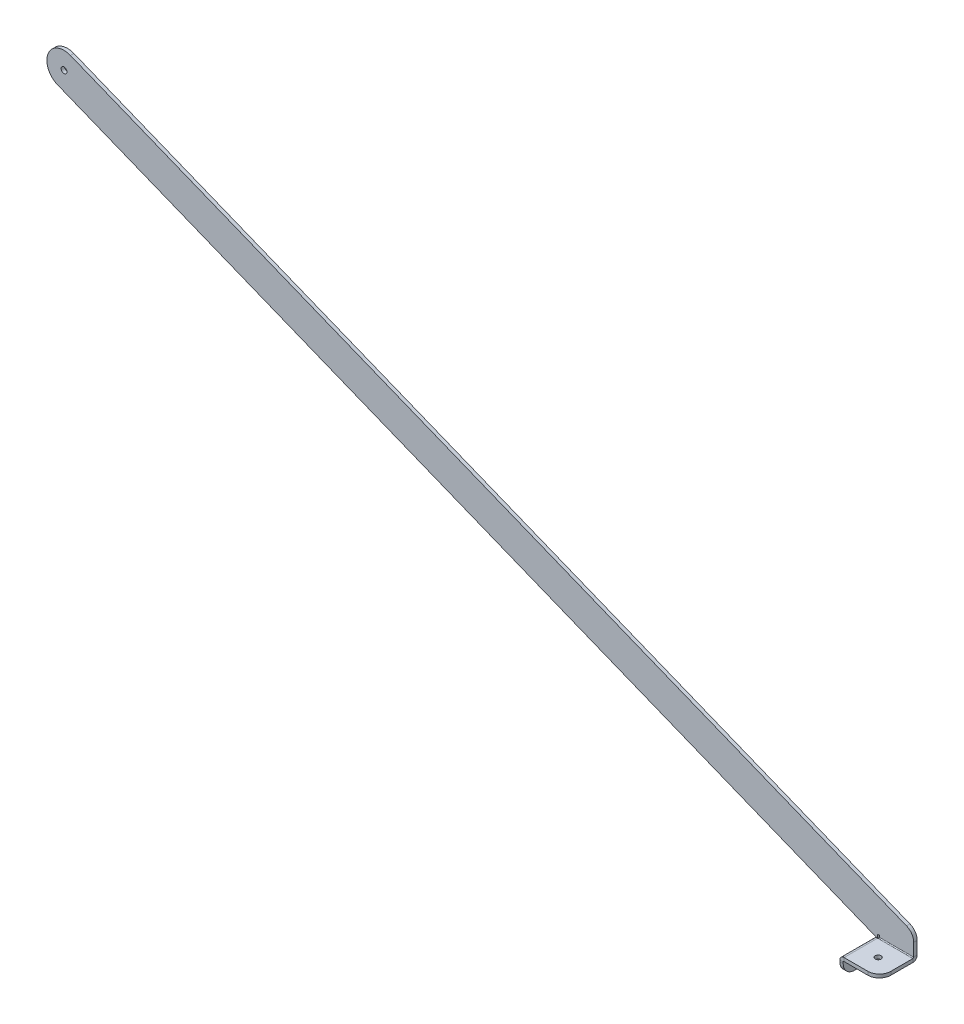
ISO-10303-21;
HEADER;
FILE_DESCRIPTION(('STEP AP214'),'2;1');
FILE_NAME('part.step','',(''),(''),'','','');
FILE_SCHEMA(('AUTOMOTIVE_DESIGN { 1 0 10303 214 1 1 1 1 }'));
ENDSEC;
DATA;
#1=APPLICATION_CONTEXT('core data for automotive mechanical design processes');
#2=APPLICATION_PROTOCOL_DEFINITION('international standard','automotive_design',2000,#1);
#3=PRODUCT_CONTEXT('',#1,'mechanical');
#4=PRODUCT('Part','Part','',(#3));
#5=PRODUCT_RELATED_PRODUCT_CATEGORY('part','',(#4));
#6=PRODUCT_DEFINITION_FORMATION('','',#4);
#7=PRODUCT_DEFINITION_CONTEXT('part definition',#1,'design');
#8=PRODUCT_DEFINITION('design','',#6,#7);
#9=PRODUCT_DEFINITION_SHAPE('','',#8);
#10=(LENGTH_UNIT() NAMED_UNIT(*) SI_UNIT(.MILLI.,.METRE.));
#11=(NAMED_UNIT(*) PLANE_ANGLE_UNIT() SI_UNIT($,.RADIAN.));
#12=(NAMED_UNIT(*) SI_UNIT($,.STERADIAN.) SOLID_ANGLE_UNIT());
#13=UNCERTAINTY_MEASURE_WITH_UNIT(LENGTH_MEASURE(1.E-05),#10,'distance_accuracy_value','');
#14=(GEOMETRIC_REPRESENTATION_CONTEXT(3) GLOBAL_UNCERTAINTY_ASSIGNED_CONTEXT((#13)) GLOBAL_UNIT_ASSIGNED_CONTEXT((#10,
#11,#12)) REPRESENTATION_CONTEXT('',''));
#15=CARTESIAN_POINT('',(0.,0.,0.));
#16=DIRECTION('',(0.,0.,1.));
#17=DIRECTION('',(1.,0.,0.));
#18=AXIS2_PLACEMENT_3D('',#15,#16,#17);
#19=CARTESIAN_POINT('',(388.5885,-144.00735,-3.));
#20=DIRECTION('',(1.,0.,0.));
#21=DIRECTION('',(0.,0.,-1.));
#22=AXIS2_PLACEMENT_3D('',#19,#20,#21);
#23=PLANE('',#22);
#24=DIRECTION('',(0.,1.,0.));
#25=VECTOR('',#24,1.);
#26=CARTESIAN_POINT('',(388.5885,-144.00735,0.));
#27=LINE('',#26,#25);
#28=CARTESIAN_POINT('',(388.5885,-141.67075,0.));
#29=VERTEX_POINT('',#28);
#30=CARTESIAN_POINT('',(388.5885,-130.486723104408,0.));
#31=VERTEX_POINT('',#30);
#32=EDGE_CURVE('E383',#29,#31,#27,.T.);
#33=ORIENTED_EDGE('',*,*,#32,.F.);
#34=DIRECTION('',(0.,0.,-1.));
#35=VECTOR('',#34,1.);
#36=CARTESIAN_POINT('',(388.5885,-141.67075,0.));
#37=LINE('',#36,#35);
#38=CARTESIAN_POINT('',(388.5885,-141.67075,-3.));
#39=VERTEX_POINT('',#38);
#40=EDGE_CURVE('E318',#29,#39,#37,.T.);
#41=ORIENTED_EDGE('',*,*,#40,.T.);
#42=DIRECTION('',(0.,1.,0.));
#43=VECTOR('',#42,1.);
#44=CARTESIAN_POINT('',(388.5885,-144.00735,-3.));
#45=LINE('',#44,#43);
#46=CARTESIAN_POINT('',(388.5885,-130.486723104408,-3.));
#47=VERTEX_POINT('',#46);
#48=EDGE_CURVE('E369',#39,#47,#45,.T.);
#49=ORIENTED_EDGE('',*,*,#48,.T.);
#50=DIRECTION('',(0.,0.,1.));
#51=VECTOR('',#50,1.);
#52=CARTESIAN_POINT('',(388.5885,-130.486723104408,-3.));
#53=LINE('',#52,#51);
#54=EDGE_CURVE('E395',#47,#31,#53,.T.);
#55=ORIENTED_EDGE('',*,*,#54,.T.);
#56=EDGE_LOOP('',(#33,#41,#49,#55));
#57=FACE_BOUND('',#56,.T.);
#58=ADVANCED_FACE('F75',(#57),#23,.T.);
#59=CARTESIAN_POINT('',(358.5885,-144.00735,-3.));
#60=DIRECTION('',(-0.372666281122487,-0.927965431960876,0.));
#61=DIRECTION('',(0.927965431960876,-0.372666281122487,0.));
#62=AXIS2_PLACEMENT_3D('',#59,#60,#61);
#63=PLANE('',#62);
#64=DIRECTION('',(0.927965431960876,-0.372666281122487,0.));
#65=VECTOR('',#64,1.);
#66=CARTESIAN_POINT('',(358.5885,-144.00735,-3.));
#67=LINE('',#66,#65);
#68=CARTESIAN_POINT('',(-358.5885,144.00735,-3.));
#69=VERTEX_POINT('',#68);
#70=CARTESIAN_POINT('',(357.0885,-143.404957494384,-3.));
#71=VERTEX_POINT('',#70);
#72=EDGE_CURVE('E365',#69,#71,#67,.T.);
#73=ORIENTED_EDGE('',*,*,#72,.T.);
#74=DIRECTION('',(0.,0.,-1.));
#75=VECTOR('',#74,1.);
#76=CARTESIAN_POINT('',(357.0885,-143.404957494384,0.));
#77=LINE('',#76,#75);
#78=CARTESIAN_POINT('',(357.0885,-143.404957494384,0.));
#79=VERTEX_POINT('',#78);
#80=EDGE_CURVE('E344',#79,#71,#77,.T.);
#81=ORIENTED_EDGE('',*,*,#80,.F.);
#82=DIRECTION('',(0.927965431960876,-0.372666281122487,0.));
#83=VECTOR('',#82,1.);
#84=CARTESIAN_POINT('',(358.5885,-144.00735,0.));
#85=LINE('',#84,#83);
#86=CARTESIAN_POINT('',(-358.5885,144.00735,0.));
#87=VERTEX_POINT('',#86);
#88=EDGE_CURVE('E380',#87,#79,#85,.T.);
#89=ORIENTED_EDGE('',*,*,#88,.F.);
#90=DIRECTION('',(0.,0.,1.));
#91=VECTOR('',#90,1.);
#92=CARTESIAN_POINT('',(-358.5885,144.00735,-3.));
#93=LINE('',#92,#91);
#94=EDGE_CURVE('E377',#69,#87,#93,.T.);
#95=ORIENTED_EDGE('',*,*,#94,.F.);
#96=EDGE_LOOP('',(#73,#81,#89,#95));
#97=FACE_BOUND('',#96,.T.);
#98=ADVANCED_FACE('F476',(#97),#63,.T.);
#99=CARTESIAN_POINT('',(-352.998505783163,157.926831479413,-3.));
#100=DIRECTION('',(0.,0.,1.));
#101=DIRECTION('',(1.,0.,0.));
#102=AXIS2_PLACEMENT_3D('',#99,#100,#101);
#103=PLANE('',#102);
#104=CARTESIAN_POINT('',(-352.998505783163,157.926831479413,-3.));
#105=DIRECTION('',(0.,0.,1.));
#106=DIRECTION('',(1.,0.,0.));
#107=AXIS2_PLACEMENT_3D('',#104,#105,#106);
#108=CIRCLE('',#107,2.54999999999999);
#109=CARTESIAN_POINT('',(-350.448505783163,157.926831479413,-3.));
#110=VERTEX_POINT('',#109);
#111=EDGE_CURVE('E356',#110,#110,#108,.T.);
#112=ORIENTED_EDGE('',*,*,#111,.T.);
#113=EDGE_LOOP('',(#112));
#114=FACE_BOUND('',#113,.T.);
#115=DIRECTION('',(1.,0.,0.));
#116=VECTOR('',#115,1.);
#117=CARTESIAN_POINT('',(388.5885,-141.67075,-3.));
#118=LINE('',#117,#116);
#119=CARTESIAN_POINT('',(358.5885,-141.67075,-3.));
#120=VERTEX_POINT('',#119);
#121=EDGE_CURVE('E311',#39,#120,#118,.F.);
#122=ORIENTED_EDGE('',*,*,#121,.T.);
#123=DIRECTION('',(0.,-1.,0.));
#124=VECTOR('',#123,1.);
#125=CARTESIAN_POINT('',(358.5885,157.926831479413,-3.));
#126=LINE('',#125,#124);
#127=CARTESIAN_POINT('',(358.5885,-140.17075,-3.));
#128=VERTEX_POINT('',#127);
#129=EDGE_CURVE('E353',#128,#120,#126,.T.);
#130=ORIENTED_EDGE('',*,*,#129,.F.);
#131=DIRECTION('',(1.,0.,0.));
#132=VECTOR('',#131,1.);
#133=CARTESIAN_POINT('',(-352.998505783163,-140.17075,-3.));
#134=LINE('',#133,#132);
#135=CARTESIAN_POINT('',(357.0885,-140.17075,-3.));
#136=VERTEX_POINT('',#135);
#137=EDGE_CURVE('E351',#136,#128,#134,.T.);
#138=ORIENTED_EDGE('',*,*,#137,.F.);
#139=DIRECTION('',(0.,1.,0.));
#140=VECTOR('',#139,1.);
#141=CARTESIAN_POINT('',(357.0885,157.926831479413,-3.));
#142=LINE('',#141,#140);
#143=EDGE_CURVE('E338',#71,#136,#142,.T.);
#144=ORIENTED_EDGE('',*,*,#143,.F.);
#145=ORIENTED_EDGE('',*,*,#72,.F.);
#146=CARTESIAN_POINT('',(-352.998505783163,157.926831479413,-3.));
#147=DIRECTION('',(0.,0.,1.));
#148=DIRECTION('',(1.,0.,0.));
#149=AXIS2_PLACEMENT_3D('',#146,#147,#148);
#150=CIRCLE('',#149,15.);
#151=CARTESIAN_POINT('',(-347.408511566325,171.846312958826,-3.));
#152=VERTEX_POINT('',#151);
#153=EDGE_CURVE('E362',#152,#69,#150,.T.);
#154=ORIENTED_EDGE('',*,*,#153,.F.);
#155=DIRECTION('',(-0.927965431960876,0.372666281122487,0.));
#156=VECTOR('',#155,1.);
#157=CARTESIAN_POINT('',(382.315162811225,-121.207068784799,-3.));
#158=LINE('',#157,#156);
#159=CARTESIAN_POINT('',(382.315162811225,-121.207068784799,-3.));
#160=VERTEX_POINT('',#159);
#161=EDGE_CURVE('E374',#160,#152,#158,.T.);
#162=ORIENTED_EDGE('',*,*,#161,.F.);
#163=CARTESIAN_POINT('',(378.5885,-130.486723104408,-3.));
#164=DIRECTION('',(0.,0.,1.));
#165=DIRECTION('',(-1.,0.,0.));
#166=AXIS2_PLACEMENT_3D('',#163,#164,#165);
#167=CIRCLE('',#166,10.);
#168=EDGE_CURVE('E371',#47,#160,#167,.T.);
#169=ORIENTED_EDGE('',*,*,#168,.F.);
#170=ORIENTED_EDGE('',*,*,#48,.F.);
#171=EDGE_LOOP('',(#122,#130,#138,#144,#145,#154,#162,#169,#170));
#172=FACE_BOUND('',#171,.T.);
#173=ADVANCED_FACE('F482',(#114,#172),#103,.F.);
#174=CARTESIAN_POINT('',(-352.998505783163,157.926831479413,0.));
#175=DIRECTION('',(0.,0.,1.));
#176=DIRECTION('',(1.,0.,0.));
#177=AXIS2_PLACEMENT_3D('',#174,#175,#176);
#178=PLANE('',#177);
#179=CARTESIAN_POINT('',(-352.998505783163,157.926831479413,0.));
#180=DIRECTION('',(0.,0.,1.));
#181=DIRECTION('',(1.,0.,0.));
#182=AXIS2_PLACEMENT_3D('',#179,#180,#181);
#183=CIRCLE('',#182,2.54999999999999);
#184=CARTESIAN_POINT('',(-350.448505783163,157.926831479413,0.));
#185=VERTEX_POINT('',#184);
#186=EDGE_CURVE('E355',#185,#185,#183,.T.);
#187=ORIENTED_EDGE('',*,*,#186,.F.);
#188=EDGE_LOOP('',(#187));
#189=FACE_BOUND('',#188,.T.);
#190=DIRECTION('',(0.,1.,0.));
#191=VECTOR('',#190,1.);
#192=CARTESIAN_POINT('',(358.5885,-141.67075,0.));
#193=LINE('',#192,#191);
#194=CARTESIAN_POINT('',(358.5885,-141.67075,0.));
#195=VERTEX_POINT('',#194);
#196=CARTESIAN_POINT('',(358.5885,-140.17075,0.));
#197=VERTEX_POINT('',#196);
#198=EDGE_CURVE('E335',#195,#197,#193,.T.);
#199=ORIENTED_EDGE('',*,*,#198,.F.);
#200=DIRECTION('',(1.,0.,0.));
#201=VECTOR('',#200,1.);
#202=CARTESIAN_POINT('',(388.5885,-141.67075,0.));
#203=LINE('',#202,#201);
#204=EDGE_CURVE('E324',#29,#195,#203,.F.);
#205=ORIENTED_EDGE('',*,*,#204,.F.);
#206=ORIENTED_EDGE('',*,*,#32,.T.);
#207=CARTESIAN_POINT('',(378.5885,-130.486723104408,0.));
#208=DIRECTION('',(0.,0.,1.));
#209=DIRECTION('',(-1.,0.,0.));
#210=AXIS2_PLACEMENT_3D('',#207,#208,#209);
#211=CIRCLE('',#210,10.);
#212=CARTESIAN_POINT('',(382.315162811225,-121.207068784799,0.));
#213=VERTEX_POINT('',#212);
#214=EDGE_CURVE('E385',#31,#213,#211,.T.);
#215=ORIENTED_EDGE('',*,*,#214,.T.);
#216=DIRECTION('',(-0.927965431960876,0.372666281122487,0.));
#217=VECTOR('',#216,1.);
#218=CARTESIAN_POINT('',(382.315162811225,-121.207068784799,0.));
#219=LINE('',#218,#217);
#220=CARTESIAN_POINT('',(-347.408511566325,171.846312958826,0.));
#221=VERTEX_POINT('',#220);
#222=EDGE_CURVE('E366',#213,#221,#219,.T.);
#223=ORIENTED_EDGE('',*,*,#222,.T.);
#224=CARTESIAN_POINT('',(-352.998505783163,157.926831479413,0.));
#225=DIRECTION('',(0.,0.,1.));
#226=DIRECTION('',(1.,0.,0.));
#227=AXIS2_PLACEMENT_3D('',#224,#225,#226);
#228=CIRCLE('',#227,15.);
#229=EDGE_CURVE('E359',#221,#87,#228,.T.);
#230=ORIENTED_EDGE('',*,*,#229,.T.);
#231=ORIENTED_EDGE('',*,*,#88,.T.);
#232=DIRECTION('',(0.,-1.,0.));
#233=VECTOR('',#232,1.);
#234=CARTESIAN_POINT('',(357.0885,-140.17075,0.));
#235=LINE('',#234,#233);
#236=CARTESIAN_POINT('',(357.0885,-140.17075,0.));
#237=VERTEX_POINT('',#236);
#238=EDGE_CURVE('E342',#237,#79,#235,.T.);
#239=ORIENTED_EDGE('',*,*,#238,.F.);
#240=DIRECTION('',(-1.,0.,0.));
#241=VECTOR('',#240,1.);
#242=CARTESIAN_POINT('',(358.5885,-140.17075,0.));
#243=LINE('',#242,#241);
#244=EDGE_CURVE('E339',#197,#237,#243,.T.);
#245=ORIENTED_EDGE('',*,*,#244,.F.);
#246=EDGE_LOOP('',(#199,#205,#206,#215,#223,#230,#231,#239,#245));
#247=FACE_BOUND('',#246,.T.);
#248=ADVANCED_FACE('F494',(#189,#247),#178,.T.);
#249=CARTESIAN_POINT('',(-352.998505783163,157.926831479413,-3.));
#250=DIRECTION('',(0.,0.,1.));
#251=DIRECTION('',(1.,0.,0.));
#252=AXIS2_PLACEMENT_3D('',#249,#250,#251);
#253=CYLINDRICAL_SURFACE('',#252,15.);
#254=ORIENTED_EDGE('',*,*,#229,.F.);
#255=DIRECTION('',(0.,0.,1.));
#256=VECTOR('',#255,1.);
#257=CARTESIAN_POINT('',(-347.408511566325,171.846312958826,-3.));
#258=LINE('',#257,#256);
#259=EDGE_CURVE('E390',#152,#221,#258,.T.);
#260=ORIENTED_EDGE('',*,*,#259,.F.);
#261=ORIENTED_EDGE('',*,*,#153,.T.);
#262=ORIENTED_EDGE('',*,*,#94,.T.);
#263=EDGE_LOOP('',(#254,#260,#261,#262));
#264=FACE_BOUND('',#263,.T.);
#265=ADVANCED_FACE('F490',(#264),#253,.T.);
#266=CARTESIAN_POINT('',(382.315162811225,-121.207068784799,-3.));
#267=DIRECTION('',(0.372666281122487,0.927965431960876,0.));
#268=DIRECTION('',(-0.927965431960876,0.372666281122487,0.));
#269=AXIS2_PLACEMENT_3D('',#266,#267,#268);
#270=PLANE('',#269);
#271=ORIENTED_EDGE('',*,*,#222,.F.);
#272=DIRECTION('',(0.,0.,1.));
#273=VECTOR('',#272,1.);
#274=CARTESIAN_POINT('',(382.315162811225,-121.207068784799,-3.));
#275=LINE('',#274,#273);
#276=EDGE_CURVE('E393',#160,#213,#275,.T.);
#277=ORIENTED_EDGE('',*,*,#276,.F.);
#278=ORIENTED_EDGE('',*,*,#161,.T.);
#279=ORIENTED_EDGE('',*,*,#259,.T.);
#280=EDGE_LOOP('',(#271,#277,#278,#279));
#281=FACE_BOUND('',#280,.T.);
#282=ADVANCED_FACE('F493',(#281),#270,.T.);
#283=CARTESIAN_POINT('',(378.5885,-130.486723104408,-3.));
#284=DIRECTION('',(0.,0.,1.));
#285=DIRECTION('',(1.,0.,0.));
#286=AXIS2_PLACEMENT_3D('',#283,#284,#285);
#287=CYLINDRICAL_SURFACE('',#286,10.);
#288=ORIENTED_EDGE('',*,*,#214,.F.);
#289=ORIENTED_EDGE('',*,*,#54,.F.);
#290=ORIENTED_EDGE('',*,*,#168,.T.);
#291=ORIENTED_EDGE('',*,*,#276,.T.);
#292=EDGE_LOOP('',(#288,#289,#290,#291));
#293=FACE_BOUND('',#292,.T.);
#294=ADVANCED_FACE('F487',(#293),#287,.T.);
#295=CARTESIAN_POINT('',(-352.998505783163,157.926831479413,-3.));
#296=DIRECTION('',(0.,0.,1.));
#297=DIRECTION('',(1.,0.,0.));
#298=AXIS2_PLACEMENT_3D('',#295,#296,#297);
#299=CYLINDRICAL_SURFACE('',#298,2.54999999999999);
#300=ORIENTED_EDGE('',*,*,#111,.F.);
#301=EDGE_LOOP('',(#300));
#302=FACE_BOUND('',#301,.T.);
#303=ORIENTED_EDGE('',*,*,#186,.T.);
#304=EDGE_LOOP('',(#303));
#305=FACE_BOUND('',#304,.T.);
#306=ADVANCED_FACE('F550',(#302,#305),#299,.F.);
#307=CARTESIAN_POINT('',(358.5885,-141.67075,0.));
#308=DIRECTION('',(-1.,0.,0.));
#309=DIRECTION('',(0.,0.,1.));
#310=AXIS2_PLACEMENT_3D('',#307,#308,#309);
#311=PLANE('',#310);
#312=DIRECTION('',(0.,0.,-1.));
#313=VECTOR('',#312,1.);
#314=CARTESIAN_POINT('',(358.5885,-140.17075,0.));
#315=LINE('',#314,#313);
#316=EDGE_CURVE('E341',#197,#128,#315,.T.);
#317=ORIENTED_EDGE('',*,*,#316,.T.);
#318=ORIENTED_EDGE('',*,*,#129,.T.);
#319=DIRECTION('',(0.,0.,-1.));
#320=VECTOR('',#319,1.);
#321=CARTESIAN_POINT('',(358.5885,-141.67075,0.));
#322=LINE('',#321,#320);
#323=EDGE_CURVE('E329',#195,#120,#322,.T.);
#324=ORIENTED_EDGE('',*,*,#323,.F.);
#325=ORIENTED_EDGE('',*,*,#198,.T.);
#326=EDGE_LOOP('',(#317,#318,#324,#325));
#327=FACE_BOUND('',#326,.T.);
#328=ADVANCED_FACE('F524',(#327),#311,.T.);
#329=CARTESIAN_POINT('',(358.5885,-140.17075,0.));
#330=DIRECTION('',(0.,-1.,0.));
#331=DIRECTION('',(0.,0.,-1.));
#332=AXIS2_PLACEMENT_3D('',#329,#330,#331);
#333=PLANE('',#332);
#334=DIRECTION('',(0.,0.,-1.));
#335=VECTOR('',#334,1.);
#336=CARTESIAN_POINT('',(357.0885,-140.17075,0.));
#337=LINE('',#336,#335);
#338=EDGE_CURVE('E332',#237,#136,#337,.T.);
#339=ORIENTED_EDGE('',*,*,#338,.T.);
#340=ORIENTED_EDGE('',*,*,#137,.T.);
#341=ORIENTED_EDGE('',*,*,#316,.F.);
#342=ORIENTED_EDGE('',*,*,#244,.T.);
#343=EDGE_LOOP('',(#339,#340,#341,#342));
#344=FACE_BOUND('',#343,.T.);
#345=ADVANCED_FACE('F531',(#344),#333,.T.);
#346=CARTESIAN_POINT('',(357.0885,-140.17075,0.));
#347=DIRECTION('',(1.,0.,0.));
#348=DIRECTION('',(0.,0.,-1.));
#349=AXIS2_PLACEMENT_3D('',#346,#347,#348);
#350=PLANE('',#349);
#351=ORIENTED_EDGE('',*,*,#80,.T.);
#352=ORIENTED_EDGE('',*,*,#143,.T.);
#353=ORIENTED_EDGE('',*,*,#338,.F.);
#354=ORIENTED_EDGE('',*,*,#238,.T.);
#355=EDGE_LOOP('',(#351,#352,#353,#354));
#356=FACE_BOUND('',#355,.T.);
#357=ADVANCED_FACE('F534',(#356),#350,.T.);
#358=CARTESIAN_POINT('',(358.5885,-141.67075,0.736600000000007));
#359=DIRECTION('',(-1.,0.,0.));
#360=DIRECTION('',(0.,0.,1.));
#361=AXIS2_PLACEMENT_3D('',#358,#359,#360);
#362=PLANE('',#361);
#363=DIRECTION('',(0.,-1.,0.));
#364=VECTOR('',#363,1.);
#365=CARTESIAN_POINT('',(358.5885,-145.40735,0.736599999999993));
#366=LINE('',#365,#364);
#367=CARTESIAN_POINT('',(358.5885,-142.40735,0.736600000000004));
#368=VERTEX_POINT('',#367);
#369=CARTESIAN_POINT('',(358.5885,-145.40735,0.736599999999993));
#370=VERTEX_POINT('',#369);
#371=EDGE_CURVE('E289',#368,#370,#366,.T.);
#372=ORIENTED_EDGE('',*,*,#371,.F.);
#373=CARTESIAN_POINT('',(358.5885,-141.67075,0.736600000000007));
#374=DIRECTION('',(1.,0.,0.));
#375=DIRECTION('',(0.,0.,-1.));
#376=AXIS2_PLACEMENT_3D('',#373,#374,#375);
#377=CIRCLE('',#376,0.736600000000004);
#378=EDGE_CURVE('E321',#195,#368,#377,.F.);
#379=ORIENTED_EDGE('',*,*,#378,.F.);
#380=ORIENTED_EDGE('',*,*,#323,.T.);
#381=CARTESIAN_POINT('',(358.5885,-141.67075,0.736600000000007));
#382=DIRECTION('',(1.,0.,0.));
#383=DIRECTION('',(0.,0.,-1.));
#384=AXIS2_PLACEMENT_3D('',#381,#382,#383);
#385=CIRCLE('',#384,3.7366);
#386=EDGE_CURVE('E314',#120,#370,#385,.F.);
#387=ORIENTED_EDGE('',*,*,#386,.T.);
#388=EDGE_LOOP('',(#372,#379,#380,#387));
#389=FACE_BOUND('',#388,.T.);
#390=ADVANCED_FACE('F521',(#389),#362,.T.);
#391=CARTESIAN_POINT('',(388.5885,-141.67075,0.736600000000007));
#392=DIRECTION('',(-1.,0.,0.));
#393=DIRECTION('',(0.,0.,1.));
#394=AXIS2_PLACEMENT_3D('',#391,#392,#393);
#395=PLANE('',#394);
#396=CARTESIAN_POINT('',(388.5885,-141.67075,0.736600000000007));
#397=DIRECTION('',(1.,0.,0.));
#398=DIRECTION('',(0.,0.,-1.));
#399=AXIS2_PLACEMENT_3D('',#396,#397,#398);
#400=CIRCLE('',#399,0.736600000000004);
#401=CARTESIAN_POINT('',(388.5885,-142.40735,0.736600000000004));
#402=VERTEX_POINT('',#401);
#403=EDGE_CURVE('E292',#402,#29,#400,.T.);
#404=ORIENTED_EDGE('',*,*,#403,.F.);
#405=DIRECTION('',(0.,-1.,0.));
#406=VECTOR('',#405,1.);
#407=CARTESIAN_POINT('',(388.5885,-142.40735,0.736600000000004));
#408=LINE('',#407,#406);
#409=CARTESIAN_POINT('',(388.5885,-145.40735,0.736599999999993));
#410=VERTEX_POINT('',#409);
#411=EDGE_CURVE('E303',#402,#410,#408,.T.);
#412=ORIENTED_EDGE('',*,*,#411,.T.);
#413=CARTESIAN_POINT('',(388.5885,-141.67075,0.736600000000007));
#414=DIRECTION('',(1.,0.,0.));
#415=DIRECTION('',(0.,0.,-1.));
#416=AXIS2_PLACEMENT_3D('',#413,#414,#415);
#417=CIRCLE('',#416,3.7366);
#418=EDGE_CURVE('E315',#410,#39,#417,.T.);
#419=ORIENTED_EDGE('',*,*,#418,.T.);
#420=ORIENTED_EDGE('',*,*,#40,.F.);
#421=EDGE_LOOP('',(#404,#412,#419,#420));
#422=FACE_BOUND('',#421,.T.);
#423=ADVANCED_FACE('F516',(#422),#395,.F.);
#424=CARTESIAN_POINT('',(388.5885,-141.67075,0.736600000000007));
#425=DIRECTION('',(1.,0.,0.));
#426=DIRECTION('',(0.,-1.,0.));
#427=AXIS2_PLACEMENT_3D('',#424,#425,#426);
#428=CYLINDRICAL_SURFACE('',#427,3.7366);
#429=ORIENTED_EDGE('',*,*,#121,.F.);
#430=ORIENTED_EDGE('',*,*,#418,.F.);
#431=DIRECTION('',(1.,0.,0.));
#432=VECTOR('',#431,1.);
#433=CARTESIAN_POINT('',(0.,-145.40735,0.736599999999993));
#434=LINE('',#433,#432);
#435=EDGE_CURVE('E300',#370,#410,#434,.T.);
#436=ORIENTED_EDGE('',*,*,#435,.F.);
#437=ORIENTED_EDGE('',*,*,#386,.F.);
#438=EDGE_LOOP('',(#429,#430,#436,#437));
#439=FACE_BOUND('',#438,.T.);
#440=ADVANCED_FACE('F511',(#439),#428,.T.);
#441=CARTESIAN_POINT('',(388.5885,-141.67075,0.736600000000007));
#442=DIRECTION('',(1.,0.,0.));
#443=DIRECTION('',(0.,-1.,0.));
#444=AXIS2_PLACEMENT_3D('',#441,#442,#443);
#445=CYLINDRICAL_SURFACE('',#444,0.736600000000004);
#446=ORIENTED_EDGE('',*,*,#204,.T.);
#447=ORIENTED_EDGE('',*,*,#378,.T.);
#448=DIRECTION('',(-1.,0.,0.));
#449=VECTOR('',#448,1.);
#450=CARTESIAN_POINT('',(358.5885,-142.40735,0.736600000000004));
#451=LINE('',#450,#449);
#452=EDGE_CURVE('E306',#368,#402,#451,.F.);
#453=ORIENTED_EDGE('',*,*,#452,.T.);
#454=ORIENTED_EDGE('',*,*,#403,.T.);
#455=EDGE_LOOP('',(#446,#447,#453,#454));
#456=FACE_BOUND('',#455,.T.);
#457=ADVANCED_FACE('F518',(#456),#445,.F.);
#458=CARTESIAN_POINT('',(388.5885,-145.40735,0.));
#459=DIRECTION('',(1.,0.,0.));
#460=DIRECTION('',(0.,0.,-1.));
#461=AXIS2_PLACEMENT_3D('',#458,#459,#460);
#462=PLANE('',#461);
#463=DIRECTION('',(0.,0.,1.));
#464=VECTOR('',#463,1.);
#465=CARTESIAN_POINT('',(388.5885,-142.40735,-5.32934252284178E-13));
#466=LINE('',#465,#464);
#467=CARTESIAN_POINT('',(388.5885,-142.40735,20.));
#468=VERTEX_POINT('',#467);
#469=EDGE_CURVE('E296',#468,#402,#466,.F.);
#470=ORIENTED_EDGE('',*,*,#469,.F.);
#471=DIRECTION('',(0.,1.,0.));
#472=VECTOR('',#471,1.);
#473=CARTESIAN_POINT('',(388.5885,-145.40735,20.));
#474=LINE('',#473,#472);
#475=CARTESIAN_POINT('',(388.5885,-145.40735,20.));
#476=VERTEX_POINT('',#475);
#477=EDGE_CURVE('E83',#468,#476,#474,.F.);
#478=ORIENTED_EDGE('',*,*,#477,.T.);
#479=DIRECTION('',(0.,0.,-1.));
#480=VECTOR('',#479,1.);
#481=CARTESIAN_POINT('',(388.5885,-145.40735,0.));
#482=LINE('',#481,#480);
#483=EDGE_CURVE('E290',#476,#410,#482,.T.);
#484=ORIENTED_EDGE('',*,*,#483,.T.);
#485=ORIENTED_EDGE('',*,*,#411,.F.);
#486=EDGE_LOOP('',(#470,#478,#484,#485));
#487=FACE_BOUND('',#486,.T.);
#488=ADVANCED_FACE('F471',(#487),#462,.T.);
#489=CARTESIAN_POINT('',(0.,-145.40735,-5.43408696300708E-13));
#490=DIRECTION('',(0.,-1.,0.));
#491=DIRECTION('',(0.,0.,-1.));
#492=AXIS2_PLACEMENT_3D('',#489,#490,#491);
#493=PLANE('',#492);
#494=CARTESIAN_POINT('',(372.5585,-145.40735,15.));
#495=DIRECTION('',(0.,-1.,0.));
#496=DIRECTION('',(0.,0.,-1.));
#497=AXIS2_PLACEMENT_3D('',#494,#495,#496);
#498=CIRCLE('',#497,2.55);
#499=CARTESIAN_POINT('',(372.5585,-145.40735,12.45));
#500=VERTEX_POINT('',#499);
#501=EDGE_CURVE('E268',#500,#500,#498,.T.);
#502=ORIENTED_EDGE('',*,*,#501,.F.);
#503=EDGE_LOOP('',(#502));
#504=FACE_BOUND('',#503,.T.);
#505=ORIENTED_EDGE('',*,*,#483,.F.);
#506=CARTESIAN_POINT('',(378.5885,-145.40735,20.));
#507=DIRECTION('',(0.,-1.,0.));
#508=DIRECTION('',(0.,0.,-1.));
#509=AXIS2_PLACEMENT_3D('',#506,#507,#508);
#510=CIRCLE('',#509,10.);
#511=CARTESIAN_POINT('',(378.5885,-145.40735,30.));
#512=VERTEX_POINT('',#511);
#513=EDGE_CURVE('E13',#476,#512,#510,.T.);
#514=ORIENTED_EDGE('',*,*,#513,.T.);
#515=DIRECTION('',(1.,0.,0.));
#516=VECTOR('',#515,1.);
#517=CARTESIAN_POINT('',(388.5885,-145.40735,30.));
#518=LINE('',#517,#516);
#519=CARTESIAN_POINT('',(357.7885,-145.40735,30.));
#520=VERTEX_POINT('',#519);
#521=EDGE_CURVE('E293',#520,#512,#518,.T.);
#522=ORIENTED_EDGE('',*,*,#521,.F.);
#523=DIRECTION('',(0.,0.,-1.));
#524=VECTOR('',#523,1.);
#525=CARTESIAN_POINT('',(357.7885,-145.40735,0.73659999999999));
#526=LINE('',#525,#524);
#527=CARTESIAN_POINT('',(357.7885,-145.40735,0.73659999999999));
#528=VERTEX_POINT('',#527);
#529=EDGE_CURVE('E275',#528,#520,#526,.F.);
#530=ORIENTED_EDGE('',*,*,#529,.F.);
#531=DIRECTION('',(1.,0.,0.));
#532=VECTOR('',#531,1.);
#533=CARTESIAN_POINT('',(357.7885,-145.40735,0.73659999999999));
#534=LINE('',#533,#532);
#535=EDGE_CURVE('E286',#528,#370,#534,.T.);
#536=ORIENTED_EDGE('',*,*,#535,.T.);
#537=ORIENTED_EDGE('',*,*,#435,.T.);
#538=EDGE_LOOP('',(#505,#514,#522,#530,#536,#537));
#539=FACE_BOUND('',#538,.T.);
#540=ADVANCED_FACE('F464',(#504,#539),#493,.T.);
#541=CARTESIAN_POINT('',(0.,-142.40735,-5.32934252284178E-13));
#542=DIRECTION('',(0.,-1.,0.));
#543=DIRECTION('',(0.,0.,-1.));
#544=AXIS2_PLACEMENT_3D('',#541,#542,#543);
#545=PLANE('',#544);
#546=CARTESIAN_POINT('',(372.5585,-142.40735,15.));
#547=DIRECTION('',(0.,1.,0.));
#548=DIRECTION('',(0.,0.,1.));
#549=AXIS2_PLACEMENT_3D('',#546,#547,#548);
#550=CIRCLE('',#549,2.55);
#551=CARTESIAN_POINT('',(372.5585,-142.40735,17.55));
#552=VERTEX_POINT('',#551);
#553=EDGE_CURVE('E457',#552,#552,#550,.T.);
#554=ORIENTED_EDGE('',*,*,#553,.F.);
#555=EDGE_LOOP('',(#554));
#556=FACE_BOUND('',#555,.T.);
#557=DIRECTION('',(-1.,0.,0.));
#558=VECTOR('',#557,1.);
#559=CARTESIAN_POINT('',(0.,-142.40735,30.));
#560=LINE('',#559,#558);
#561=CARTESIAN_POINT('',(357.7885,-142.40735,30.));
#562=VERTEX_POINT('',#561);
#563=CARTESIAN_POINT('',(378.5885,-142.40735,30.));
#564=VERTEX_POINT('',#563);
#565=EDGE_CURVE('E298',#562,#564,#560,.F.);
#566=ORIENTED_EDGE('',*,*,#565,.T.);
#567=CARTESIAN_POINT('',(378.5885,-142.40735,20.));
#568=DIRECTION('',(0.,-1.,0.));
#569=DIRECTION('',(0.,0.,-1.));
#570=AXIS2_PLACEMENT_3D('',#567,#568,#569);
#571=CIRCLE('',#570,10.);
#572=EDGE_CURVE('E97',#564,#468,#571,.F.);
#573=ORIENTED_EDGE('',*,*,#572,.T.);
#574=ORIENTED_EDGE('',*,*,#469,.T.);
#575=ORIENTED_EDGE('',*,*,#452,.F.);
#576=DIRECTION('',(1.,0.,0.));
#577=VECTOR('',#576,1.);
#578=CARTESIAN_POINT('',(357.7885,-142.40735,0.73659999999999));
#579=LINE('',#578,#577);
#580=CARTESIAN_POINT('',(357.7885,-142.40735,0.73659999999999));
#581=VERTEX_POINT('',#580);
#582=EDGE_CURVE('E281',#581,#368,#579,.T.);
#583=ORIENTED_EDGE('',*,*,#582,.F.);
#584=DIRECTION('',(0.,0.,-1.));
#585=VECTOR('',#584,1.);
#586=CARTESIAN_POINT('',(357.7885,-142.40735,0.73659999999999));
#587=LINE('',#586,#585);
#588=EDGE_CURVE('E223',#581,#562,#587,.F.);
#589=ORIENTED_EDGE('',*,*,#588,.T.);
#590=EDGE_LOOP('',(#566,#573,#574,#575,#583,#589));
#591=FACE_BOUND('',#590,.T.);
#592=ADVANCED_FACE('F426',(#556,#591),#545,.F.);
#593=CARTESIAN_POINT('',(388.5885,-145.40735,30.));
#594=DIRECTION('',(0.,0.,1.));
#595=DIRECTION('',(0.,-1.,0.));
#596=AXIS2_PLACEMENT_3D('',#593,#594,#595);
#597=PLANE('',#596);
#598=ORIENTED_EDGE('',*,*,#521,.T.);
#599=DIRECTION('',(0.,1.,0.));
#600=VECTOR('',#599,1.);
#601=CARTESIAN_POINT('',(378.5885,-145.40735,30.));
#602=LINE('',#601,#600);
#603=EDGE_CURVE('E415',#512,#564,#602,.T.);
#604=ORIENTED_EDGE('',*,*,#603,.T.);
#605=ORIENTED_EDGE('',*,*,#565,.F.);
#606=DIRECTION('',(0.,1.,0.));
#607=VECTOR('',#606,1.);
#608=CARTESIAN_POINT('',(357.7885,-145.40735,30.));
#609=LINE('',#608,#607);
#610=EDGE_CURVE('E278',#520,#562,#609,.T.);
#611=ORIENTED_EDGE('',*,*,#610,.F.);
#612=EDGE_LOOP('',(#598,#604,#605,#611));
#613=FACE_BOUND('',#612,.T.);
#614=ADVANCED_FACE('F421',(#613),#597,.T.);
#615=CARTESIAN_POINT('',(357.7885,-145.40735,0.73659999999999));
#616=DIRECTION('',(0.,0.,-1.));
#617=DIRECTION('',(0.,1.,0.));
#618=AXIS2_PLACEMENT_3D('',#615,#616,#617);
#619=PLANE('',#618);
#620=ORIENTED_EDGE('',*,*,#535,.F.);
#621=DIRECTION('',(0.,1.,0.));
#622=VECTOR('',#621,1.);
#623=CARTESIAN_POINT('',(357.7885,-145.40735,0.73659999999999));
#624=LINE('',#623,#622);
#625=EDGE_CURVE('E271',#528,#581,#624,.T.);
#626=ORIENTED_EDGE('',*,*,#625,.T.);
#627=ORIENTED_EDGE('',*,*,#582,.T.);
#628=ORIENTED_EDGE('',*,*,#371,.T.);
#629=EDGE_LOOP('',(#620,#626,#627,#628));
#630=FACE_BOUND('',#629,.T.);
#631=ADVANCED_FACE('F430',(#630),#619,.T.);
#632=CARTESIAN_POINT('',(357.7885,-146.14395,30.));
#633=DIRECTION('',(0.,0.,1.));
#634=DIRECTION('',(1.,0.,0.));
#635=AXIS2_PLACEMENT_3D('',#632,#633,#634);
#636=PLANE('',#635);
#637=DIRECTION('',(1.,0.,0.));
#638=VECTOR('',#637,1.);
#639=CARTESIAN_POINT('',(354.0519,-146.14395,30.));
#640=LINE('',#639,#638);
#641=CARTESIAN_POINT('',(357.0519,-146.14395,30.));
#642=VERTEX_POINT('',#641);
#643=CARTESIAN_POINT('',(354.0519,-146.14395,30.));
#644=VERTEX_POINT('',#643);
#645=EDGE_CURVE('E265',#642,#644,#640,.F.);
#646=ORIENTED_EDGE('',*,*,#645,.F.);
#647=CARTESIAN_POINT('',(357.7885,-146.14395,30.));
#648=DIRECTION('',(0.,0.,-1.));
#649=DIRECTION('',(-1.,0.,0.));
#650=AXIS2_PLACEMENT_3D('',#647,#648,#649);
#651=CIRCLE('',#650,0.736599999999976);
#652=EDGE_CURVE('E226',#520,#642,#651,.F.);
#653=ORIENTED_EDGE('',*,*,#652,.F.);
#654=ORIENTED_EDGE('',*,*,#610,.T.);
#655=CARTESIAN_POINT('',(357.7885,-146.14395,30.));
#656=DIRECTION('',(0.,0.,-1.));
#657=DIRECTION('',(-1.,0.,0.));
#658=AXIS2_PLACEMENT_3D('',#655,#656,#657);
#659=CIRCLE('',#658,3.73659999999998);
#660=EDGE_CURVE('E270',#562,#644,#659,.F.);
#661=ORIENTED_EDGE('',*,*,#660,.T.);
#662=EDGE_LOOP('',(#646,#653,#654,#661));
#663=FACE_BOUND('',#662,.T.);
#664=ADVANCED_FACE('F689',(#663),#636,.T.);
#665=CARTESIAN_POINT('',(357.7885,-146.14395,0.73659999999999));
#666=DIRECTION('',(0.,0.,1.));
#667=DIRECTION('',(1.,0.,0.));
#668=AXIS2_PLACEMENT_3D('',#665,#666,#667);
#669=PLANE('',#668);
#670=CARTESIAN_POINT('',(357.7885,-146.14395,0.73659999999999));
#671=DIRECTION('',(0.,0.,-1.));
#672=DIRECTION('',(-1.,0.,0.));
#673=AXIS2_PLACEMENT_3D('',#670,#671,#672);
#674=CIRCLE('',#673,0.736599999999976);
#675=CARTESIAN_POINT('',(357.0519,-146.14395,0.73659999999999));
#676=VERTEX_POINT('',#675);
#677=EDGE_CURVE('E233',#676,#528,#674,.T.);
#678=ORIENTED_EDGE('',*,*,#677,.F.);
#679=DIRECTION('',(1.,0.,0.));
#680=VECTOR('',#679,1.);
#681=CARTESIAN_POINT('',(357.0519,-146.14395,0.73659999999999));
#682=LINE('',#681,#680);
#683=CARTESIAN_POINT('',(354.0519,-146.14395,0.73659999999999));
#684=VERTEX_POINT('',#683);
#685=EDGE_CURVE('E230',#676,#684,#682,.F.);
#686=ORIENTED_EDGE('',*,*,#685,.T.);
#687=CARTESIAN_POINT('',(357.7885,-146.14395,0.73659999999999));
#688=DIRECTION('',(0.,0.,-1.));
#689=DIRECTION('',(-1.,0.,0.));
#690=AXIS2_PLACEMENT_3D('',#687,#688,#689);
#691=CIRCLE('',#690,3.73659999999998);
#692=EDGE_CURVE('E216',#684,#581,#691,.T.);
#693=ORIENTED_EDGE('',*,*,#692,.T.);
#694=ORIENTED_EDGE('',*,*,#625,.F.);
#695=EDGE_LOOP('',(#678,#686,#693,#694));
#696=FACE_BOUND('',#695,.T.);
#697=ADVANCED_FACE('F231',(#696),#669,.F.);
#698=CARTESIAN_POINT('',(357.7885,-146.14395,0.73659999999999));
#699=DIRECTION('',(0.,0.,-1.));
#700=DIRECTION('',(-1.,0.,0.));
#701=AXIS2_PLACEMENT_3D('',#698,#699,#700);
#702=CYLINDRICAL_SURFACE('',#701,3.73659999999998);
#703=ORIENTED_EDGE('',*,*,#588,.F.);
#704=ORIENTED_EDGE('',*,*,#692,.F.);
#705=DIRECTION('',(0.,0.,-1.));
#706=VECTOR('',#705,1.);
#707=CARTESIAN_POINT('',(354.0519,-146.14395,-5.54454978572783E-13));
#708=LINE('',#707,#706);
#709=EDGE_CURVE('E220',#644,#684,#708,.T.);
#710=ORIENTED_EDGE('',*,*,#709,.F.);
#711=ORIENTED_EDGE('',*,*,#660,.F.);
#712=EDGE_LOOP('',(#703,#704,#710,#711));
#713=FACE_BOUND('',#712,.T.);
#714=ADVANCED_FACE('F218',(#713),#702,.T.);
#715=CARTESIAN_POINT('',(357.7885,-146.14395,0.73659999999999));
#716=DIRECTION('',(0.,0.,-1.));
#717=DIRECTION('',(-1.,0.,0.));
#718=AXIS2_PLACEMENT_3D('',#715,#716,#717);
#719=CYLINDRICAL_SURFACE('',#718,0.736599999999976);
#720=ORIENTED_EDGE('',*,*,#529,.T.);
#721=ORIENTED_EDGE('',*,*,#652,.T.);
#722=DIRECTION('',(0.,0.,1.));
#723=VECTOR('',#722,1.);
#724=CARTESIAN_POINT('',(357.0519,-146.14395,30.));
#725=LINE('',#724,#723);
#726=EDGE_CURVE('E238',#642,#676,#725,.F.);
#727=ORIENTED_EDGE('',*,*,#726,.T.);
#728=ORIENTED_EDGE('',*,*,#677,.T.);
#729=EDGE_LOOP('',(#720,#721,#727,#728));
#730=FACE_BOUND('',#729,.T.);
#731=ADVANCED_FACE('F433',(#730),#719,.F.);
#732=CARTESIAN_POINT('',(354.0519,-145.40735,0.736599999999993));
#733=DIRECTION('',(0.,0.,1.));
#734=DIRECTION('',(0.,-1.,0.));
#735=AXIS2_PLACEMENT_3D('',#732,#733,#734);
#736=PLANE('',#735);
#737=DIRECTION('',(0.,-1.,0.));
#738=VECTOR('',#737,1.);
#739=CARTESIAN_POINT('',(357.0519,-145.40735,0.736599999999993));
#740=LINE('',#739,#738);
#741=CARTESIAN_POINT('',(357.0519,-147.40735,0.736599999999985));
#742=VERTEX_POINT('',#741);
#743=EDGE_CURVE('E247',#676,#742,#740,.T.);
#744=ORIENTED_EDGE('',*,*,#743,.T.);
#745=DIRECTION('',(1.,0.,0.));
#746=VECTOR('',#745,1.);
#747=CARTESIAN_POINT('',(354.0519,-147.40735,0.736599999999985));
#748=LINE('',#747,#746);
#749=CARTESIAN_POINT('',(354.0519,-147.40735,0.736599999999985));
#750=VERTEX_POINT('',#749);
#751=EDGE_CURVE('E251',#742,#750,#748,.F.);
#752=ORIENTED_EDGE('',*,*,#751,.T.);
#753=DIRECTION('',(0.,1.,0.));
#754=VECTOR('',#753,1.);
#755=CARTESIAN_POINT('',(354.051900000001,-1.65110580979551E-12,0.736600000000541));
#756=LINE('',#755,#754);
#757=EDGE_CURVE('E243',#684,#750,#756,.F.);
#758=ORIENTED_EDGE('',*,*,#757,.F.);
#759=ORIENTED_EDGE('',*,*,#685,.F.);
#760=EDGE_LOOP('',(#744,#752,#758,#759));
#761=FACE_BOUND('',#760,.T.);
#762=ADVANCED_FACE('F249',(#761),#736,.F.);
#763=CARTESIAN_POINT('',(354.0519,-157.40735,29.9999999999999));
#764=DIRECTION('',(0.,0.,-1.));
#765=DIRECTION('',(0.,1.,0.));
#766=AXIS2_PLACEMENT_3D('',#763,#764,#765);
#767=PLANE('',#766);
#768=DIRECTION('',(0.,-1.,0.));
#769=VECTOR('',#768,1.);
#770=CARTESIAN_POINT('',(354.051900000001,-1.77843485445589E-12,30.0000000000006));
#771=LINE('',#770,#769);
#772=CARTESIAN_POINT('',(354.0519,-147.40735,30.));
#773=VERTEX_POINT('',#772);
#774=EDGE_CURVE('E246',#773,#644,#771,.F.);
#775=ORIENTED_EDGE('',*,*,#774,.F.);
#776=DIRECTION('',(1.,0.,0.));
#777=VECTOR('',#776,1.);
#778=CARTESIAN_POINT('',(354.0519,-147.40735,30.));
#779=LINE('',#778,#777);
#780=CARTESIAN_POINT('',(357.0519,-147.40735,30.));
#781=VERTEX_POINT('',#780);
#782=EDGE_CURVE('E412',#773,#781,#779,.T.);
#783=ORIENTED_EDGE('',*,*,#782,.T.);
#784=DIRECTION('',(0.,1.,0.));
#785=VECTOR('',#784,1.);
#786=CARTESIAN_POINT('',(357.0519,-157.40735,29.9999999999999));
#787=LINE('',#786,#785);
#788=EDGE_CURVE('E253',#781,#642,#787,.T.);
#789=ORIENTED_EDGE('',*,*,#788,.T.);
#790=ORIENTED_EDGE('',*,*,#645,.T.);
#791=EDGE_LOOP('',(#775,#783,#789,#790));
#792=FACE_BOUND('',#791,.T.);
#793=ADVANCED_FACE('F452',(#792),#767,.F.);
#794=CARTESIAN_POINT('',(354.051900000001,-1.64833059375763E-12,0.));
#795=DIRECTION('',(-1.,0.,0.));
#796=DIRECTION('',(0.,-1.,0.));
#797=AXIS2_PLACEMENT_3D('',#794,#795,#796);
#798=PLANE('',#797);
#799=ORIENTED_EDGE('',*,*,#757,.T.);
#800=CARTESIAN_POINT('',(354.0519,-147.40735,10.7366));
#801=DIRECTION('',(-1.,0.,0.));
#802=DIRECTION('',(0.,-1.,0.));
#803=AXIS2_PLACEMENT_3D('',#800,#801,#802);
#804=CIRCLE('',#803,10.);
#805=CARTESIAN_POINT('',(354.0519,-157.40735,10.7365999999999));
#806=VERTEX_POINT('',#805);
#807=EDGE_CURVE('E410',#750,#806,#804,.T.);
#808=ORIENTED_EDGE('',*,*,#807,.T.);
#809=DIRECTION('',(0.,0.,-1.));
#810=VECTOR('',#809,1.);
#811=CARTESIAN_POINT('',(354.0519,-157.40735,-5.97187149187144E-13));
#812=LINE('',#811,#810);
#813=CARTESIAN_POINT('',(354.0519,-157.40735,19.9999999999999));
#814=VERTEX_POINT('',#813);
#815=EDGE_CURVE('E252',#806,#814,#812,.F.);
#816=ORIENTED_EDGE('',*,*,#815,.T.);
#817=CARTESIAN_POINT('',(354.0519,-147.40735,20.));
#818=DIRECTION('',(-1.,0.,0.));
#819=DIRECTION('',(0.,-1.,0.));
#820=AXIS2_PLACEMENT_3D('',#817,#818,#819);
#821=CIRCLE('',#820,10.);
#822=EDGE_CURVE('E408',#814,#773,#821,.T.);
#823=ORIENTED_EDGE('',*,*,#822,.T.);
#824=ORIENTED_EDGE('',*,*,#774,.T.);
#825=ORIENTED_EDGE('',*,*,#709,.T.);
#826=EDGE_LOOP('',(#799,#808,#816,#823,#824,#825));
#827=FACE_BOUND('',#826,.T.);
#828=ADVANCED_FACE('F242',(#827),#798,.T.);
#829=CARTESIAN_POINT('',(357.051900000001,-1.65880503777416E-12,0.));
#830=DIRECTION('',(-1.,0.,0.));
#831=DIRECTION('',(0.,-1.,0.));
#832=AXIS2_PLACEMENT_3D('',#829,#830,#831);
#833=PLANE('',#832);
#834=DIRECTION('',(0.,0.,1.));
#835=VECTOR('',#834,1.);
#836=CARTESIAN_POINT('',(357.0519,-157.40735,0.736599999999948));
#837=LINE('',#836,#835);
#838=CARTESIAN_POINT('',(357.0519,-157.40735,10.7365999999999));
#839=VERTEX_POINT('',#838);
#840=CARTESIAN_POINT('',(357.0519,-157.40735,19.9999999999999));
#841=VERTEX_POINT('',#840);
#842=EDGE_CURVE('E257',#839,#841,#837,.T.);
#843=ORIENTED_EDGE('',*,*,#842,.F.);
#844=CARTESIAN_POINT('',(357.0519,-147.40735,10.7366));
#845=DIRECTION('',(-1.,0.,0.));
#846=DIRECTION('',(0.,-1.,0.));
#847=AXIS2_PLACEMENT_3D('',#844,#845,#846);
#848=CIRCLE('',#847,10.);
#849=EDGE_CURVE('E405',#839,#742,#848,.F.);
#850=ORIENTED_EDGE('',*,*,#849,.T.);
#851=ORIENTED_EDGE('',*,*,#743,.F.);
#852=ORIENTED_EDGE('',*,*,#726,.F.);
#853=ORIENTED_EDGE('',*,*,#788,.F.);
#854=CARTESIAN_POINT('',(357.0519,-147.40735,20.));
#855=DIRECTION('',(-1.,0.,0.));
#856=DIRECTION('',(0.,-1.,0.));
#857=AXIS2_PLACEMENT_3D('',#854,#855,#856);
#858=CIRCLE('',#857,10.);
#859=EDGE_CURVE('E403',#781,#841,#858,.F.);
#860=ORIENTED_EDGE('',*,*,#859,.T.);
#861=EDGE_LOOP('',(#843,#850,#851,#852,#853,#860));
#862=FACE_BOUND('',#861,.T.);
#863=ADVANCED_FACE('F439',(#862),#833,.F.);
#864=CARTESIAN_POINT('',(354.0519,-157.40735,0.736599999999948));
#865=DIRECTION('',(0.,1.,0.));
#866=DIRECTION('',(0.,0.,1.));
#867=AXIS2_PLACEMENT_3D('',#864,#865,#866);
#868=PLANE('',#867);
#869=ORIENTED_EDGE('',*,*,#815,.F.);
#870=DIRECTION('',(1.,0.,0.));
#871=VECTOR('',#870,1.);
#872=CARTESIAN_POINT('',(354.0519,-157.40735,10.7365999999999));
#873=LINE('',#872,#871);
#874=EDGE_CURVE('E400',#806,#839,#873,.T.);
#875=ORIENTED_EDGE('',*,*,#874,.T.);
#876=ORIENTED_EDGE('',*,*,#842,.T.);
#877=DIRECTION('',(1.,0.,0.));
#878=VECTOR('',#877,1.);
#879=CARTESIAN_POINT('',(354.0519,-157.40735,19.9999999999999));
#880=LINE('',#879,#878);
#881=EDGE_CURVE('E392',#841,#814,#880,.F.);
#882=ORIENTED_EDGE('',*,*,#881,.T.);
#883=EDGE_LOOP('',(#869,#875,#876,#882));
#884=FACE_BOUND('',#883,.T.);
#885=ADVANCED_FACE('F446',(#884),#868,.F.);
#886=CARTESIAN_POINT('',(354.0519,-147.40735,10.7366));
#887=DIRECTION('',(1.,0.,0.));
#888=DIRECTION('',(0.,1.,0.));
#889=AXIS2_PLACEMENT_3D('',#886,#887,#888);
#890=CYLINDRICAL_SURFACE('',#889,10.);
#891=ORIENTED_EDGE('',*,*,#807,.F.);
#892=ORIENTED_EDGE('',*,*,#751,.F.);
#893=ORIENTED_EDGE('',*,*,#849,.F.);
#894=ORIENTED_EDGE('',*,*,#874,.F.);
#895=EDGE_LOOP('',(#891,#892,#893,#894));
#896=FACE_BOUND('',#895,.T.);
#897=ADVANCED_FACE('F441',(#896),#890,.T.);
#898=CARTESIAN_POINT('',(354.0519,-147.40735,20.));
#899=DIRECTION('',(1.,0.,0.));
#900=DIRECTION('',(0.,1.,0.));
#901=AXIS2_PLACEMENT_3D('',#898,#899,#900);
#902=CYLINDRICAL_SURFACE('',#901,10.);
#903=ORIENTED_EDGE('',*,*,#822,.F.);
#904=ORIENTED_EDGE('',*,*,#881,.F.);
#905=ORIENTED_EDGE('',*,*,#859,.F.);
#906=ORIENTED_EDGE('',*,*,#782,.F.);
#907=EDGE_LOOP('',(#903,#904,#905,#906));
#908=FACE_BOUND('',#907,.T.);
#909=ADVANCED_FACE('F449',(#908),#902,.T.);
#910=CARTESIAN_POINT('',(378.5885,-145.40735,20.));
#911=DIRECTION('',(0.,1.,0.));
#912=DIRECTION('',(0.,0.,1.));
#913=AXIS2_PLACEMENT_3D('',#910,#911,#912);
#914=CYLINDRICAL_SURFACE('',#913,10.);
#915=ORIENTED_EDGE('',*,*,#513,.F.);
#916=ORIENTED_EDGE('',*,*,#477,.F.);
#917=ORIENTED_EDGE('',*,*,#572,.F.);
#918=ORIENTED_EDGE('',*,*,#603,.F.);
#919=EDGE_LOOP('',(#915,#916,#917,#918));
#920=FACE_BOUND('',#919,.T.);
#921=ADVANCED_FACE('F77',(#920),#914,.T.);
#922=CARTESIAN_POINT('',(372.5585,-142.40735,15.));
#923=DIRECTION('',(0.,1.,0.));
#924=DIRECTION('',(0.,0.,1.));
#925=AXIS2_PLACEMENT_3D('',#922,#923,#924);
#926=CYLINDRICAL_SURFACE('',#925,2.55);
#927=ORIENTED_EDGE('',*,*,#501,.T.);
#928=EDGE_LOOP('',(#927));
#929=FACE_BOUND('',#928,.T.);
#930=ORIENTED_EDGE('',*,*,#553,.T.);
#931=EDGE_LOOP('',(#930));
#932=FACE_BOUND('',#931,.T.);
#933=ADVANCED_FACE('F461',(#929,#932),#926,.F.);
#934=CLOSED_SHELL('',(#58,#98,#173,#248,#265,#282,#294,#306,#328,#345,#357,#390,#423,#440,#457,
#488,#540,#592,#614,#631,#664,#697,#714,#731,#762,#793,#828,#863,#885,#897,#909,#921,#933));
#935=MANIFOLD_SOLID_BREP('B2',#934);
#936=ADVANCED_BREP_SHAPE_REPRESENTATION('',(#18,#935),#14);
#937=SHAPE_DEFINITION_REPRESENTATION(#9,#936);
ENDSEC;
END-ISO-10303-21;
